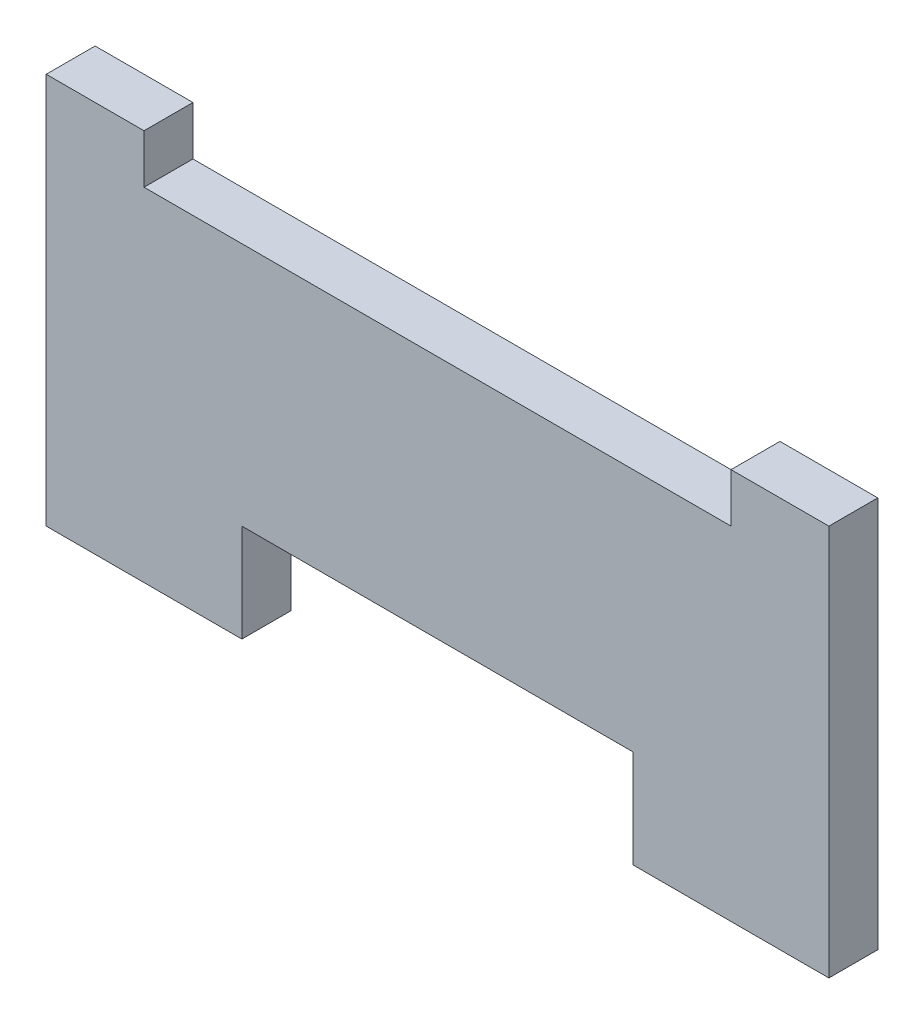
ISO-10303-21;
HEADER;
FILE_DESCRIPTION(('STEP AP214'),'2;1');
FILE_NAME('part.step','',(''),(''),'','','');
FILE_SCHEMA(('AUTOMOTIVE_DESIGN { 1 0 10303 214 1 1 1 1 }'));
ENDSEC;
DATA;
#1=APPLICATION_CONTEXT('core data for automotive mechanical design processes');
#2=APPLICATION_PROTOCOL_DEFINITION('international standard','automotive_design',2000,#1);
#3=PRODUCT_CONTEXT('',#1,'mechanical');
#4=PRODUCT('Part','Part','',(#3));
#5=PRODUCT_RELATED_PRODUCT_CATEGORY('part','',(#4));
#6=PRODUCT_DEFINITION_FORMATION('','',#4);
#7=PRODUCT_DEFINITION_CONTEXT('part definition',#1,'design');
#8=PRODUCT_DEFINITION('design','',#6,#7);
#9=PRODUCT_DEFINITION_SHAPE('','',#8);
#10=(LENGTH_UNIT() NAMED_UNIT(*) SI_UNIT(.MILLI.,.METRE.));
#11=(NAMED_UNIT(*) PLANE_ANGLE_UNIT() SI_UNIT($,.RADIAN.));
#12=(NAMED_UNIT(*) SI_UNIT($,.STERADIAN.) SOLID_ANGLE_UNIT());
#13=UNCERTAINTY_MEASURE_WITH_UNIT(LENGTH_MEASURE(1.E-05),#10,'distance_accuracy_value','');
#14=(GEOMETRIC_REPRESENTATION_CONTEXT(3) GLOBAL_UNCERTAINTY_ASSIGNED_CONTEXT((#13)) GLOBAL_UNIT_ASSIGNED_CONTEXT((#10,
#11,#12)) REPRESENTATION_CONTEXT('',''));
#15=CARTESIAN_POINT('',(0.,0.,0.));
#16=DIRECTION('',(0.,0.,1.));
#17=DIRECTION('',(1.,0.,0.));
#18=AXIS2_PLACEMENT_3D('',#15,#16,#17);
#19=CARTESIAN_POINT('',(0.,0.,0.5));
#20=DIRECTION('',(0.,1.,0.));
#21=DIRECTION('',(0.,0.,1.));
#22=AXIS2_PLACEMENT_3D('',#19,#20,#21);
#23=PLANE('',#22);
#24=DIRECTION('',(1.,0.,0.));
#25=VECTOR('',#24,1.);
#26=CARTESIAN_POINT('',(0.,0.,0.));
#27=LINE('',#26,#25);
#28=CARTESIAN_POINT('',(0.,0.,0.));
#29=VERTEX_POINT('',#28);
#30=CARTESIAN_POINT('',(2.,0.,0.));
#31=VERTEX_POINT('',#30);
#32=EDGE_CURVE('E202',#29,#31,#27,.T.);
#33=ORIENTED_EDGE('',*,*,#32,.T.);
#34=DIRECTION('',(0.,0.,1.));
#35=VECTOR('',#34,1.);
#36=CARTESIAN_POINT('',(2.,0.,0.));
#37=LINE('',#36,#35);
#38=CARTESIAN_POINT('',(2.,0.,0.5));
#39=VERTEX_POINT('',#38);
#40=EDGE_CURVE('E169',#31,#39,#37,.T.);
#41=ORIENTED_EDGE('',*,*,#40,.T.);
#42=DIRECTION('',(1.,0.,0.));
#43=VECTOR('',#42,1.);
#44=CARTESIAN_POINT('',(0.,0.,0.5));
#45=LINE('',#44,#43);
#46=CARTESIAN_POINT('',(0.,0.,0.5));
#47=VERTEX_POINT('',#46);
#48=EDGE_CURVE('E189',#47,#39,#45,.T.);
#49=ORIENTED_EDGE('',*,*,#48,.F.);
#50=DIRECTION('',(0.,0.,-1.));
#51=VECTOR('',#50,1.);
#52=CARTESIAN_POINT('',(0.,0.,0.5));
#53=LINE('',#52,#51);
#54=EDGE_CURVE('E11',#47,#29,#53,.T.);
#55=ORIENTED_EDGE('',*,*,#54,.T.);
#56=EDGE_LOOP('',(#33,#41,#49,#55));
#57=FACE_BOUND('',#56,.T.);
#58=ADVANCED_FACE('F35',(#57),#23,.F.);
#59=CARTESIAN_POINT('',(0.,4.,0.5));
#60=DIRECTION('',(0.,-1.,0.));
#61=DIRECTION('',(0.,0.,-1.));
#62=AXIS2_PLACEMENT_3D('',#59,#60,#61);
#63=PLANE('',#62);
#64=DIRECTION('',(-1.,0.,0.));
#65=VECTOR('',#64,1.);
#66=CARTESIAN_POINT('',(0.,4.,0.5));
#67=LINE('',#66,#65);
#68=CARTESIAN_POINT('',(0.999999999999999,4.,0.5));
#69=VERTEX_POINT('',#68);
#70=CARTESIAN_POINT('',(0.,4.,0.5));
#71=VERTEX_POINT('',#70);
#72=EDGE_CURVE('E194',#69,#71,#67,.T.);
#73=ORIENTED_EDGE('',*,*,#72,.F.);
#74=DIRECTION('',(0.,0.,1.));
#75=VECTOR('',#74,1.);
#76=CARTESIAN_POINT('',(0.999999999999999,4.,0.));
#77=LINE('',#76,#75);
#78=CARTESIAN_POINT('',(0.999999999999999,4.,0.));
#79=VERTEX_POINT('',#78);
#80=EDGE_CURVE('E154',#79,#69,#77,.T.);
#81=ORIENTED_EDGE('',*,*,#80,.F.);
#82=DIRECTION('',(-1.,0.,0.));
#83=VECTOR('',#82,1.);
#84=CARTESIAN_POINT('',(0.,4.,0.));
#85=LINE('',#84,#83);
#86=CARTESIAN_POINT('',(0.,4.,0.));
#87=VERTEX_POINT('',#86);
#88=EDGE_CURVE('E144',#79,#87,#85,.T.);
#89=ORIENTED_EDGE('',*,*,#88,.T.);
#90=DIRECTION('',(0.,0.,-1.));
#91=VECTOR('',#90,1.);
#92=CARTESIAN_POINT('',(0.,4.,0.5));
#93=LINE('',#92,#91);
#94=EDGE_CURVE('E198',#71,#87,#93,.T.);
#95=ORIENTED_EDGE('',*,*,#94,.F.);
#96=EDGE_LOOP('',(#73,#81,#89,#95));
#97=FACE_BOUND('',#96,.T.);
#98=ADVANCED_FACE('F245',(#97),#63,.F.);
#99=CARTESIAN_POINT('',(0.,0.,0.5));
#100=DIRECTION('',(1.,0.,0.));
#101=DIRECTION('',(0.,0.,-1.));
#102=AXIS2_PLACEMENT_3D('',#99,#100,#101);
#103=PLANE('',#102);
#104=DIRECTION('',(0.,-1.,0.));
#105=VECTOR('',#104,1.);
#106=CARTESIAN_POINT('',(0.,0.,0.));
#107=LINE('',#106,#105);
#108=EDGE_CURVE('E156',#87,#29,#107,.T.);
#109=ORIENTED_EDGE('',*,*,#108,.T.);
#110=ORIENTED_EDGE('',*,*,#54,.F.);
#111=DIRECTION('',(0.,-1.,0.));
#112=VECTOR('',#111,1.);
#113=CARTESIAN_POINT('',(0.,0.,0.5));
#114=LINE('',#113,#112);
#115=EDGE_CURVE('E184',#71,#47,#114,.T.);
#116=ORIENTED_EDGE('',*,*,#115,.F.);
#117=ORIENTED_EDGE('',*,*,#94,.T.);
#118=EDGE_LOOP('',(#109,#110,#116,#117));
#119=FACE_BOUND('',#118,.T.);
#120=ADVANCED_FACE('F37',(#119),#103,.F.);
#121=CARTESIAN_POINT('',(6.,0.,0.5));
#122=VERTEX_POINT('',#121);
#123=CARTESIAN_POINT('',(8.,0.,0.5));
#124=VERTEX_POINT('',#123);
#125=EDGE_CURVE('E187',#122,#124,#45,.T.);
#126=ORIENTED_EDGE('',*,*,#125,.F.);
#127=DIRECTION('',(0.,0.,1.));
#128=VECTOR('',#127,1.);
#129=CARTESIAN_POINT('',(6.,0.,0.));
#130=LINE('',#129,#128);
#131=CARTESIAN_POINT('',(6.,0.,0.));
#132=VERTEX_POINT('',#131);
#133=EDGE_CURVE('E180',#132,#122,#130,.T.);
#134=ORIENTED_EDGE('',*,*,#133,.F.);
#135=CARTESIAN_POINT('',(8.,0.,0.));
#136=VERTEX_POINT('',#135);
#137=EDGE_CURVE('E201',#132,#136,#27,.T.);
#138=ORIENTED_EDGE('',*,*,#137,.T.);
#139=DIRECTION('',(0.,0.,-1.));
#140=VECTOR('',#139,1.);
#141=CARTESIAN_POINT('',(8.,0.,0.5));
#142=LINE('',#141,#140);
#143=EDGE_CURVE('E43',#124,#136,#142,.T.);
#144=ORIENTED_EDGE('',*,*,#143,.F.);
#145=EDGE_LOOP('',(#126,#134,#138,#144));
#146=FACE_BOUND('',#145,.T.);
#147=ADVANCED_FACE('F233',(#146),#23,.F.);
#148=CARTESIAN_POINT('',(8.,0.,0.5));
#149=DIRECTION('',(-1.,0.,0.));
#150=DIRECTION('',(0.,0.,1.));
#151=AXIS2_PLACEMENT_3D('',#148,#149,#150);
#152=PLANE('',#151);
#153=DIRECTION('',(0.,1.,0.));
#154=VECTOR('',#153,1.);
#155=CARTESIAN_POINT('',(8.,0.,0.));
#156=LINE('',#155,#154);
#157=CARTESIAN_POINT('',(8.,4.,0.));
#158=VERTEX_POINT('',#157);
#159=EDGE_CURVE('E205',#136,#158,#156,.T.);
#160=ORIENTED_EDGE('',*,*,#159,.T.);
#161=DIRECTION('',(0.,0.,-1.));
#162=VECTOR('',#161,1.);
#163=CARTESIAN_POINT('',(8.,4.,0.5));
#164=LINE('',#163,#162);
#165=CARTESIAN_POINT('',(8.,4.,0.5));
#166=VERTEX_POINT('',#165);
#167=EDGE_CURVE('E211',#166,#158,#164,.T.);
#168=ORIENTED_EDGE('',*,*,#167,.F.);
#169=DIRECTION('',(0.,1.,0.));
#170=VECTOR('',#169,1.);
#171=CARTESIAN_POINT('',(8.,0.,0.5));
#172=LINE('',#171,#170);
#173=EDGE_CURVE('E192',#124,#166,#172,.T.);
#174=ORIENTED_EDGE('',*,*,#173,.F.);
#175=ORIENTED_EDGE('',*,*,#143,.T.);
#176=EDGE_LOOP('',(#160,#168,#174,#175));
#177=FACE_BOUND('',#176,.T.);
#178=ADVANCED_FACE('F218',(#177),#152,.F.);
#179=CARTESIAN_POINT('',(7.,4.,0.));
#180=VERTEX_POINT('',#179);
#181=EDGE_CURVE('E188',#158,#180,#85,.T.);
#182=ORIENTED_EDGE('',*,*,#181,.T.);
#183=DIRECTION('',(0.,0.,1.));
#184=VECTOR('',#183,1.);
#185=CARTESIAN_POINT('',(7.,4.,0.));
#186=LINE('',#185,#184);
#187=CARTESIAN_POINT('',(7.,4.,0.5));
#188=VERTEX_POINT('',#187);
#189=EDGE_CURVE('E157',#180,#188,#186,.T.);
#190=ORIENTED_EDGE('',*,*,#189,.T.);
#191=EDGE_CURVE('E195',#166,#188,#67,.T.);
#192=ORIENTED_EDGE('',*,*,#191,.F.);
#193=ORIENTED_EDGE('',*,*,#167,.T.);
#194=EDGE_LOOP('',(#182,#190,#192,#193));
#195=FACE_BOUND('',#194,.T.);
#196=ADVANCED_FACE('F225',(#195),#63,.F.);
#197=CARTESIAN_POINT('',(0.,0.,0.5));
#198=DIRECTION('',(0.,0.,-1.));
#199=DIRECTION('',(-1.,0.,0.));
#200=AXIS2_PLACEMENT_3D('',#197,#198,#199);
#201=PLANE('',#200);
#202=DIRECTION('',(1.,0.,0.));
#203=VECTOR('',#202,1.);
#204=CARTESIAN_POINT('',(1.,3.5,0.5));
#205=LINE('',#204,#203);
#206=CARTESIAN_POINT('',(1.,3.5,0.5));
#207=VERTEX_POINT('',#206);
#208=CARTESIAN_POINT('',(7.,3.5,0.5));
#209=VERTEX_POINT('',#208);
#210=EDGE_CURVE('E147',#207,#209,#205,.T.);
#211=ORIENTED_EDGE('',*,*,#210,.F.);
#212=DIRECTION('',(0.,-1.,0.));
#213=VECTOR('',#212,1.);
#214=CARTESIAN_POINT('',(0.999999999999999,4.,0.5));
#215=LINE('',#214,#213);
#216=EDGE_CURVE('E130',#69,#207,#215,.T.);
#217=ORIENTED_EDGE('',*,*,#216,.F.);
#218=ORIENTED_EDGE('',*,*,#72,.T.);
#219=ORIENTED_EDGE('',*,*,#115,.T.);
#220=ORIENTED_EDGE('',*,*,#48,.T.);
#221=DIRECTION('',(0.,-1.,0.));
#222=VECTOR('',#221,1.);
#223=CARTESIAN_POINT('',(2.,0.,0.5));
#224=LINE('',#223,#222);
#225=CARTESIAN_POINT('',(2.,1.,0.5));
#226=VERTEX_POINT('',#225);
#227=EDGE_CURVE('E170',#226,#39,#224,.T.);
#228=ORIENTED_EDGE('',*,*,#227,.F.);
#229=DIRECTION('',(-1.,0.,0.));
#230=VECTOR('',#229,1.);
#231=CARTESIAN_POINT('',(2.,1.,0.5));
#232=LINE('',#231,#230);
#233=CARTESIAN_POINT('',(6.,1.,0.5));
#234=VERTEX_POINT('',#233);
#235=EDGE_CURVE('E165',#234,#226,#232,.T.);
#236=ORIENTED_EDGE('',*,*,#235,.F.);
#237=DIRECTION('',(0.,1.,0.));
#238=VECTOR('',#237,1.);
#239=CARTESIAN_POINT('',(6.,0.,0.5));
#240=LINE('',#239,#238);
#241=EDGE_CURVE('E172',#122,#234,#240,.T.);
#242=ORIENTED_EDGE('',*,*,#241,.F.);
#243=ORIENTED_EDGE('',*,*,#125,.T.);
#244=ORIENTED_EDGE('',*,*,#173,.T.);
#245=ORIENTED_EDGE('',*,*,#191,.T.);
#246=DIRECTION('',(0.,1.,0.));
#247=VECTOR('',#246,1.);
#248=CARTESIAN_POINT('',(7.,4.,0.5));
#249=LINE('',#248,#247);
#250=EDGE_CURVE('E145',#209,#188,#249,.T.);
#251=ORIENTED_EDGE('',*,*,#250,.F.);
#252=EDGE_LOOP('',(#211,#217,#218,#219,#220,#228,#236,#242,#243,#244,#245,#251));
#253=FACE_BOUND('',#252,.T.);
#254=ADVANCED_FACE('F229',(#253),#201,.F.);
#255=CARTESIAN_POINT('',(0.,0.,0.));
#256=DIRECTION('',(0.,0.,-1.));
#257=DIRECTION('',(-1.,0.,0.));
#258=AXIS2_PLACEMENT_3D('',#255,#256,#257);
#259=PLANE('',#258);
#260=DIRECTION('',(0.,-1.,0.));
#261=VECTOR('',#260,1.);
#262=CARTESIAN_POINT('',(0.999999999999999,4.,0.));
#263=LINE('',#262,#261);
#264=CARTESIAN_POINT('',(1.,3.5,0.));
#265=VERTEX_POINT('',#264);
#266=EDGE_CURVE('E127',#79,#265,#263,.T.);
#267=ORIENTED_EDGE('',*,*,#266,.T.);
#268=DIRECTION('',(1.,0.,0.));
#269=VECTOR('',#268,1.);
#270=CARTESIAN_POINT('',(1.,3.5,0.));
#271=LINE('',#270,#269);
#272=CARTESIAN_POINT('',(7.,3.5,0.));
#273=VERTEX_POINT('',#272);
#274=EDGE_CURVE('E137',#265,#273,#271,.T.);
#275=ORIENTED_EDGE('',*,*,#274,.T.);
#276=DIRECTION('',(0.,1.,0.));
#277=VECTOR('',#276,1.);
#278=CARTESIAN_POINT('',(7.,4.,0.));
#279=LINE('',#278,#277);
#280=EDGE_CURVE('E50',#273,#180,#279,.T.);
#281=ORIENTED_EDGE('',*,*,#280,.T.);
#282=ORIENTED_EDGE('',*,*,#181,.F.);
#283=ORIENTED_EDGE('',*,*,#159,.F.);
#284=ORIENTED_EDGE('',*,*,#137,.F.);
#285=DIRECTION('',(0.,1.,0.));
#286=VECTOR('',#285,1.);
#287=CARTESIAN_POINT('',(6.,0.,0.));
#288=LINE('',#287,#286);
#289=CARTESIAN_POINT('',(6.,1.,0.));
#290=VERTEX_POINT('',#289);
#291=EDGE_CURVE('E164',#132,#290,#288,.T.);
#292=ORIENTED_EDGE('',*,*,#291,.T.);
#293=DIRECTION('',(-1.,0.,0.));
#294=VECTOR('',#293,1.);
#295=CARTESIAN_POINT('',(2.,1.,0.));
#296=LINE('',#295,#294);
#297=CARTESIAN_POINT('',(2.,1.,0.));
#298=VERTEX_POINT('',#297);
#299=EDGE_CURVE('E58',#290,#298,#296,.T.);
#300=ORIENTED_EDGE('',*,*,#299,.T.);
#301=DIRECTION('',(0.,-1.,0.));
#302=VECTOR('',#301,1.);
#303=CARTESIAN_POINT('',(2.,0.,0.));
#304=LINE('',#303,#302);
#305=EDGE_CURVE('E161',#298,#31,#304,.T.);
#306=ORIENTED_EDGE('',*,*,#305,.T.);
#307=ORIENTED_EDGE('',*,*,#32,.F.);
#308=ORIENTED_EDGE('',*,*,#108,.F.);
#309=ORIENTED_EDGE('',*,*,#88,.F.);
#310=EDGE_LOOP('',(#267,#275,#281,#282,#283,#284,#292,#300,#306,#307,#308,#309));
#311=FACE_BOUND('',#310,.T.);
#312=ADVANCED_FACE('F142',(#311),#259,.T.);
#313=CARTESIAN_POINT('',(2.,0.,0.));
#314=DIRECTION('',(-1.,0.,0.));
#315=DIRECTION('',(0.,-1.,0.));
#316=AXIS2_PLACEMENT_3D('',#313,#314,#315);
#317=PLANE('',#316);
#318=ORIENTED_EDGE('',*,*,#227,.T.);
#319=ORIENTED_EDGE('',*,*,#40,.F.);
#320=ORIENTED_EDGE('',*,*,#305,.F.);
#321=DIRECTION('',(0.,0.,1.));
#322=VECTOR('',#321,1.);
#323=CARTESIAN_POINT('',(2.,1.,0.));
#324=LINE('',#323,#322);
#325=EDGE_CURVE('E152',#298,#226,#324,.T.);
#326=ORIENTED_EDGE('',*,*,#325,.T.);
#327=EDGE_LOOP('',(#318,#319,#320,#326));
#328=FACE_BOUND('',#327,.T.);
#329=ADVANCED_FACE('F247',(#328),#317,.F.);
#330=CARTESIAN_POINT('',(2.,1.,0.));
#331=DIRECTION('',(0.,1.,0.));
#332=DIRECTION('',(-1.,0.,0.));
#333=AXIS2_PLACEMENT_3D('',#330,#331,#332);
#334=PLANE('',#333);
#335=ORIENTED_EDGE('',*,*,#235,.T.);
#336=ORIENTED_EDGE('',*,*,#325,.F.);
#337=ORIENTED_EDGE('',*,*,#299,.F.);
#338=DIRECTION('',(0.,0.,1.));
#339=VECTOR('',#338,1.);
#340=CARTESIAN_POINT('',(6.,1.,0.));
#341=LINE('',#340,#339);
#342=EDGE_CURVE('E178',#290,#234,#341,.T.);
#343=ORIENTED_EDGE('',*,*,#342,.T.);
#344=EDGE_LOOP('',(#335,#336,#337,#343));
#345=FACE_BOUND('',#344,.T.);
#346=ADVANCED_FACE('F248',(#345),#334,.F.);
#347=CARTESIAN_POINT('',(6.,0.,0.));
#348=DIRECTION('',(1.,0.,0.));
#349=DIRECTION('',(0.,0.,-1.));
#350=AXIS2_PLACEMENT_3D('',#347,#348,#349);
#351=PLANE('',#350);
#352=ORIENTED_EDGE('',*,*,#241,.T.);
#353=ORIENTED_EDGE('',*,*,#342,.F.);
#354=ORIENTED_EDGE('',*,*,#291,.F.);
#355=ORIENTED_EDGE('',*,*,#133,.T.);
#356=EDGE_LOOP('',(#352,#353,#354,#355));
#357=FACE_BOUND('',#356,.T.);
#358=ADVANCED_FACE('F235',(#357),#351,.F.);
#359=CARTESIAN_POINT('',(0.999999999999999,4.,0.));
#360=DIRECTION('',(-1.,0.,0.));
#361=DIRECTION('',(0.,-1.,0.));
#362=AXIS2_PLACEMENT_3D('',#359,#360,#361);
#363=PLANE('',#362);
#364=ORIENTED_EDGE('',*,*,#216,.T.);
#365=DIRECTION('',(0.,0.,1.));
#366=VECTOR('',#365,1.);
#367=CARTESIAN_POINT('',(1.,3.5,0.));
#368=LINE('',#367,#366);
#369=EDGE_CURVE('E123',#265,#207,#368,.T.);
#370=ORIENTED_EDGE('',*,*,#369,.F.);
#371=ORIENTED_EDGE('',*,*,#266,.F.);
#372=ORIENTED_EDGE('',*,*,#80,.T.);
#373=EDGE_LOOP('',(#364,#370,#371,#372));
#374=FACE_BOUND('',#373,.T.);
#375=ADVANCED_FACE('F125',(#374),#363,.F.);
#376=CARTESIAN_POINT('',(7.,4.,0.));
#377=DIRECTION('',(1.,0.,0.));
#378=DIRECTION('',(0.,1.,0.));
#379=AXIS2_PLACEMENT_3D('',#376,#377,#378);
#380=PLANE('',#379);
#381=ORIENTED_EDGE('',*,*,#250,.T.);
#382=ORIENTED_EDGE('',*,*,#189,.F.);
#383=ORIENTED_EDGE('',*,*,#280,.F.);
#384=DIRECTION('',(0.,0.,1.));
#385=VECTOR('',#384,1.);
#386=CARTESIAN_POINT('',(7.,3.5,0.));
#387=LINE('',#386,#385);
#388=EDGE_CURVE('E134',#273,#209,#387,.T.);
#389=ORIENTED_EDGE('',*,*,#388,.T.);
#390=EDGE_LOOP('',(#381,#382,#383,#389));
#391=FACE_BOUND('',#390,.T.);
#392=ADVANCED_FACE('F331',(#391),#380,.F.);
#393=CARTESIAN_POINT('',(1.,3.5,0.));
#394=DIRECTION('',(0.,-1.,0.));
#395=DIRECTION('',(1.,0.,0.));
#396=AXIS2_PLACEMENT_3D('',#393,#394,#395);
#397=PLANE('',#396);
#398=ORIENTED_EDGE('',*,*,#210,.T.);
#399=ORIENTED_EDGE('',*,*,#388,.F.);
#400=ORIENTED_EDGE('',*,*,#274,.F.);
#401=ORIENTED_EDGE('',*,*,#369,.T.);
#402=EDGE_LOOP('',(#398,#399,#400,#401));
#403=FACE_BOUND('',#402,.T.);
#404=ADVANCED_FACE('F138',(#403),#397,.F.);
#405=CLOSED_SHELL('',(#58,#98,#120,#147,#178,#196,#254,#312,#329,#346,#358,#375,#392,#404));
#406=MANIFOLD_SOLID_BREP('B2',#405);
#407=ADVANCED_BREP_SHAPE_REPRESENTATION('',(#18,#406),#14);
#408=SHAPE_DEFINITION_REPRESENTATION(#9,#407);
ENDSEC;
END-ISO-10303-21;
